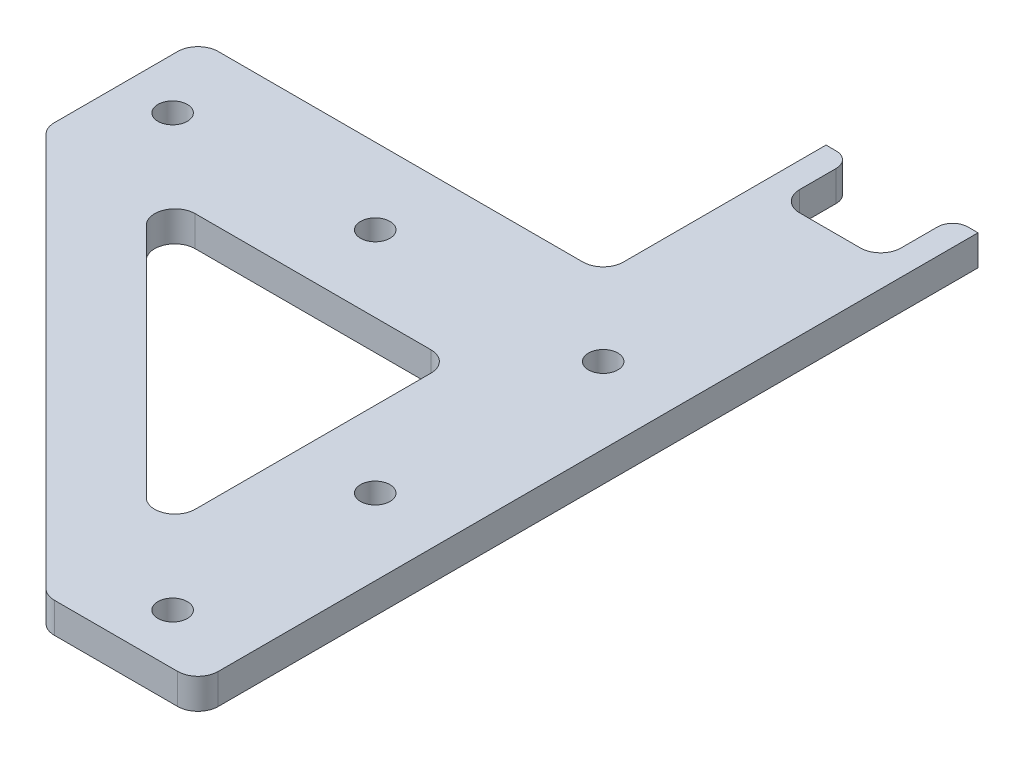
ISO-10303-21;
HEADER;
FILE_DESCRIPTION(('STEP AP214'),'2;1');
FILE_NAME('part.step','',(''),(''),'','','');
FILE_SCHEMA(('AUTOMOTIVE_DESIGN { 1 0 10303 214 1 1 1 1 }'));
ENDSEC;
DATA;
#1=APPLICATION_CONTEXT('core data for automotive mechanical design processes');
#2=APPLICATION_PROTOCOL_DEFINITION('international standard','automotive_design',2000,#1);
#3=PRODUCT_CONTEXT('',#1,'mechanical');
#4=PRODUCT('Part','Part','',(#3));
#5=PRODUCT_RELATED_PRODUCT_CATEGORY('part','',(#4));
#6=PRODUCT_DEFINITION_FORMATION('','',#4);
#7=PRODUCT_DEFINITION_CONTEXT('part definition',#1,'design');
#8=PRODUCT_DEFINITION('design','',#6,#7);
#9=PRODUCT_DEFINITION_SHAPE('','',#8);
#10=(LENGTH_UNIT() NAMED_UNIT(*) SI_UNIT(.MILLI.,.METRE.));
#11=(NAMED_UNIT(*) PLANE_ANGLE_UNIT() SI_UNIT($,.RADIAN.));
#12=(NAMED_UNIT(*) SI_UNIT($,.STERADIAN.) SOLID_ANGLE_UNIT());
#13=UNCERTAINTY_MEASURE_WITH_UNIT(LENGTH_MEASURE(1.E-05),#10,'distance_accuracy_value','');
#14=(GEOMETRIC_REPRESENTATION_CONTEXT(3) GLOBAL_UNCERTAINTY_ASSIGNED_CONTEXT((#13)) GLOBAL_UNIT_ASSIGNED_CONTEXT((#10,
#11,#12)) REPRESENTATION_CONTEXT('',''));
#15=CARTESIAN_POINT('',(0.,0.,0.));
#16=DIRECTION('',(0.,0.,1.));
#17=DIRECTION('',(1.,0.,0.));
#18=AXIS2_PLACEMENT_3D('',#15,#16,#17);
#19=CARTESIAN_POINT('',(-7.5,-26.6270539113887,-22.));
#20=DIRECTION('',(0.,0.,-1.));
#21=DIRECTION('',(-1.,0.,0.));
#22=AXIS2_PLACEMENT_3D('',#19,#20,#21);
#23=PLANE('',#22);
#24=DIRECTION('',(-1.,0.,0.));
#25=VECTOR('',#24,1.);
#26=CARTESIAN_POINT('',(-7.5,3.,-22.));
#27=LINE('',#26,#25);
#28=CARTESIAN_POINT('',(-6.5,3.,-22.));
#29=VERTEX_POINT('',#28);
#30=CARTESIAN_POINT('',(-7.5,3.,-22.));
#31=VERTEX_POINT('',#30);
#32=EDGE_CURVE('E212',#29,#31,#27,.T.);
#33=ORIENTED_EDGE('',*,*,#32,.F.);
#34=DIRECTION('',(0.,1.,0.));
#35=VECTOR('',#34,1.);
#36=CARTESIAN_POINT('',(-6.5,0.,-22.));
#37=LINE('',#36,#35);
#38=CARTESIAN_POINT('',(-6.5,0.,-22.));
#39=VERTEX_POINT('',#38);
#40=EDGE_CURVE('E11',#29,#39,#37,.F.);
#41=ORIENTED_EDGE('',*,*,#40,.T.);
#42=DIRECTION('',(-1.,0.,0.));
#43=VECTOR('',#42,1.);
#44=CARTESIAN_POINT('',(-7.5,0.,-22.));
#45=LINE('',#44,#43);
#46=CARTESIAN_POINT('',(-7.5,0.,-22.));
#47=VERTEX_POINT('',#46);
#48=EDGE_CURVE('E225',#39,#47,#45,.T.);
#49=ORIENTED_EDGE('',*,*,#48,.T.);
#50=DIRECTION('',(0.,1.,0.));
#51=VECTOR('',#50,1.);
#52=CARTESIAN_POINT('',(-7.5,-26.6270539113887,-22.));
#53=LINE('',#52,#51);
#54=EDGE_CURVE('E224',#47,#31,#53,.T.);
#55=ORIENTED_EDGE('',*,*,#54,.T.);
#56=EDGE_LOOP('',(#33,#41,#49,#55));
#57=FACE_BOUND('',#56,.T.);
#58=ADVANCED_FACE('F41',(#57),#23,.T.);
#59=CARTESIAN_POINT('',(-47.5,3.,0.));
#60=DIRECTION('',(0.,0.,1.));
#61=DIRECTION('',(1.,0.,0.));
#62=AXIS2_PLACEMENT_3D('',#59,#60,#61);
#63=PLANE('',#62);
#64=DIRECTION('',(-1.,0.,0.));
#65=VECTOR('',#64,1.);
#66=CARTESIAN_POINT('',(-47.5,0.,0.));
#67=LINE('',#66,#65);
#68=CARTESIAN_POINT('',(-9.5,0.,0.));
#69=VERTEX_POINT('',#68);
#70=CARTESIAN_POINT('',(-45.5,0.,0.));
#71=VERTEX_POINT('',#70);
#72=EDGE_CURVE('E296',#69,#71,#67,.T.);
#73=ORIENTED_EDGE('',*,*,#72,.T.);
#74=DIRECTION('',(0.,-1.,0.));
#75=VECTOR('',#74,1.);
#76=CARTESIAN_POINT('',(-45.5,3.,0.));
#77=LINE('',#76,#75);
#78=CARTESIAN_POINT('',(-45.5,3.,0.));
#79=VERTEX_POINT('',#78);
#80=EDGE_CURVE('E387',#71,#79,#77,.F.);
#81=ORIENTED_EDGE('',*,*,#80,.T.);
#82=DIRECTION('',(-1.,0.,0.));
#83=VECTOR('',#82,1.);
#84=CARTESIAN_POINT('',(0.,3.,0.));
#85=LINE('',#84,#83);
#86=CARTESIAN_POINT('',(-9.5,3.,0.));
#87=VERTEX_POINT('',#86);
#88=EDGE_CURVE('E307',#87,#79,#85,.T.);
#89=ORIENTED_EDGE('',*,*,#88,.F.);
#90=DIRECTION('',(0.,1.,0.));
#91=VECTOR('',#90,1.);
#92=CARTESIAN_POINT('',(-9.5,3.,0.));
#93=LINE('',#92,#91);
#94=EDGE_CURVE('E385',#87,#69,#93,.F.);
#95=ORIENTED_EDGE('',*,*,#94,.T.);
#96=EDGE_LOOP('',(#73,#81,#89,#95));
#97=FACE_BOUND('',#96,.T.);
#98=ADVANCED_FACE('F507',(#97),#63,.F.);
#99=CARTESIAN_POINT('',(0.,3.,0.));
#100=DIRECTION('',(0.,-1.,0.));
#101=DIRECTION('',(0.,0.,-1.));
#102=AXIS2_PLACEMENT_3D('',#99,#100,#101);
#103=PLANE('',#102);
#104=DIRECTION('',(0.,0.,1.));
#105=VECTOR('',#104,1.);
#106=CARTESIAN_POINT('',(-7.5,3.,55.));
#107=LINE('',#106,#105);
#108=CARTESIAN_POINT('',(-7.5,3.,17.));
#109=VERTEX_POINT('',#108);
#110=CARTESIAN_POINT('',(-7.5,3.,40.2720779386421));
#111=VERTEX_POINT('',#110);
#112=EDGE_CURVE('E299',#109,#111,#107,.T.);
#113=ORIENTED_EDGE('',*,*,#112,.T.);
#114=CARTESIAN_POINT('',(-9.5,3.,40.2720779386421));
#115=DIRECTION('',(0.,-1.,0.));
#116=DIRECTION('',(0.,0.,-1.));
#117=AXIS2_PLACEMENT_3D('',#114,#115,#116);
#118=CIRCLE('',#117,2.);
#119=CARTESIAN_POINT('',(-10.9142135623731,3.,41.6862915010152));
#120=VERTEX_POINT('',#119);
#121=EDGE_CURVE('E390',#111,#120,#118,.T.);
#122=ORIENTED_EDGE('',*,*,#121,.T.);
#123=DIRECTION('',(-0.707106781186547,0.,-0.707106781186547));
#124=VECTOR('',#123,1.);
#125=CARTESIAN_POINT('',(-7.5,3.,45.1005050633883));
#126=LINE('',#125,#124);
#127=CARTESIAN_POINT('',(-34.1862915010152,3.,18.4142135623731));
#128=VERTEX_POINT('',#127);
#129=EDGE_CURVE('E250',#120,#128,#126,.T.);
#130=ORIENTED_EDGE('',*,*,#129,.T.);
#131=CARTESIAN_POINT('',(-32.7720779386421,3.,17.));
#132=DIRECTION('',(0.,-1.,0.));
#133=DIRECTION('',(0.,0.,-1.));
#134=AXIS2_PLACEMENT_3D('',#131,#132,#133);
#135=CIRCLE('',#134,2.);
#136=CARTESIAN_POINT('',(-32.7720779386421,3.,15.));
#137=VERTEX_POINT('',#136);
#138=EDGE_CURVE('E394',#128,#137,#135,.T.);
#139=ORIENTED_EDGE('',*,*,#138,.T.);
#140=DIRECTION('',(1.,0.,0.));
#141=VECTOR('',#140,1.);
#142=CARTESIAN_POINT('',(-7.5,3.,15.));
#143=LINE('',#142,#141);
#144=CARTESIAN_POINT('',(-9.5,3.,15.));
#145=VERTEX_POINT('',#144);
#146=EDGE_CURVE('E295',#137,#145,#143,.T.);
#147=ORIENTED_EDGE('',*,*,#146,.T.);
#148=CARTESIAN_POINT('',(-9.5,3.,17.));
#149=DIRECTION('',(0.,-1.,0.));
#150=DIRECTION('',(0.,0.,-1.));
#151=AXIS2_PLACEMENT_3D('',#148,#149,#150);
#152=CIRCLE('',#151,2.);
#153=EDGE_CURVE('E400',#145,#109,#152,.T.);
#154=ORIENTED_EDGE('',*,*,#153,.T.);
#155=EDGE_LOOP('',(#113,#122,#130,#139,#147,#154));
#156=FACE_BOUND('',#155,.T.);
#157=CARTESIAN_POINT('',(7.5,3.,-22.));
#158=VERTEX_POINT('',#157);
#159=CARTESIAN_POINT('',(6.5,3.,-22.));
#160=VERTEX_POINT('',#159);
#161=EDGE_CURVE('E221',#158,#160,#27,.T.);
#162=ORIENTED_EDGE('',*,*,#161,.T.);
#163=CARTESIAN_POINT('',(6.5,3.,-20.5));
#164=DIRECTION('',(0.,-1.,0.));
#165=DIRECTION('',(0.,0.,-1.));
#166=AXIS2_PLACEMENT_3D('',#163,#164,#165);
#167=CIRCLE('',#166,1.5);
#168=CARTESIAN_POINT('',(5.,3.,-20.5));
#169=VERTEX_POINT('',#168);
#170=EDGE_CURVE('E419',#160,#169,#167,.F.);
#171=ORIENTED_EDGE('',*,*,#170,.T.);
#172=DIRECTION('',(0.,0.,-1.));
#173=VECTOR('',#172,1.);
#174=CARTESIAN_POINT('',(5.,3.,-22.));
#175=LINE('',#174,#173);
#176=CARTESIAN_POINT('',(5.,3.,-16.9));
#177=VERTEX_POINT('',#176);
#178=EDGE_CURVE('E437',#177,#169,#175,.T.);
#179=ORIENTED_EDGE('',*,*,#178,.F.);
#180=CARTESIAN_POINT('',(3.,3.,-16.9));
#181=DIRECTION('',(0.,-1.,0.));
#182=DIRECTION('',(0.,0.,-1.));
#183=AXIS2_PLACEMENT_3D('',#180,#181,#182);
#184=CIRCLE('',#183,2.);
#185=CARTESIAN_POINT('',(3.,3.,-14.9));
#186=VERTEX_POINT('',#185);
#187=EDGE_CURVE('E402',#177,#186,#184,.T.);
#188=ORIENTED_EDGE('',*,*,#187,.T.);
#189=DIRECTION('',(1.,0.,0.));
#190=VECTOR('',#189,1.);
#191=CARTESIAN_POINT('',(-5.,3.,-14.9));
#192=LINE('',#191,#190);
#193=CARTESIAN_POINT('',(-3.,3.,-14.9));
#194=VERTEX_POINT('',#193);
#195=EDGE_CURVE('E434',#194,#186,#192,.T.);
#196=ORIENTED_EDGE('',*,*,#195,.F.);
#197=CARTESIAN_POINT('',(-3.,3.,-16.9));
#198=DIRECTION('',(0.,-1.,0.));
#199=DIRECTION('',(0.,0.,-1.));
#200=AXIS2_PLACEMENT_3D('',#197,#198,#199);
#201=CIRCLE('',#200,2.);
#202=CARTESIAN_POINT('',(-5.,3.,-16.9));
#203=VERTEX_POINT('',#202);
#204=EDGE_CURVE('E406',#194,#203,#201,.T.);
#205=ORIENTED_EDGE('',*,*,#204,.T.);
#206=DIRECTION('',(0.,0.,1.));
#207=VECTOR('',#206,1.);
#208=CARTESIAN_POINT('',(-5.,3.,-22.));
#209=LINE('',#208,#207);
#210=CARTESIAN_POINT('',(-5.,3.,-20.5));
#211=VERTEX_POINT('',#210);
#212=EDGE_CURVE('E429',#211,#203,#209,.T.);
#213=ORIENTED_EDGE('',*,*,#212,.F.);
#214=CARTESIAN_POINT('',(-6.5,3.,-20.5));
#215=DIRECTION('',(0.,-1.,0.));
#216=DIRECTION('',(0.,0.,-1.));
#217=AXIS2_PLACEMENT_3D('',#214,#215,#216);
#218=CIRCLE('',#217,1.5);
#219=EDGE_CURVE('E220',#211,#29,#218,.F.);
#220=ORIENTED_EDGE('',*,*,#219,.T.);
#221=ORIENTED_EDGE('',*,*,#32,.T.);
#222=DIRECTION('',(0.,0.,1.));
#223=VECTOR('',#222,1.);
#224=CARTESIAN_POINT('',(-7.5,3.,0.));
#225=LINE('',#224,#223);
#226=CARTESIAN_POINT('',(-7.5,3.,-2.));
#227=VERTEX_POINT('',#226);
#228=EDGE_CURVE('E218',#31,#227,#225,.T.);
#229=ORIENTED_EDGE('',*,*,#228,.T.);
#230=CARTESIAN_POINT('',(-9.5,3.,-2.));
#231=DIRECTION('',(0.,-1.,0.));
#232=DIRECTION('',(0.,0.,-1.));
#233=AXIS2_PLACEMENT_3D('',#230,#231,#232);
#234=CIRCLE('',#233,2.);
#235=EDGE_CURVE('E411',#227,#87,#234,.T.);
#236=ORIENTED_EDGE('',*,*,#235,.T.);
#237=ORIENTED_EDGE('',*,*,#88,.T.);
#238=CARTESIAN_POINT('',(-45.5,3.,2.));
#239=DIRECTION('',(0.,-1.,0.));
#240=DIRECTION('',(0.,0.,-1.));
#241=AXIS2_PLACEMENT_3D('',#238,#239,#240);
#242=CIRCLE('',#241,2.);
#243=CARTESIAN_POINT('',(-47.5,3.,2.));
#244=VERTEX_POINT('',#243);
#245=EDGE_CURVE('E364',#79,#244,#242,.F.);
#246=ORIENTED_EDGE('',*,*,#245,.T.);
#247=DIRECTION('',(0.,0.,1.));
#248=VECTOR('',#247,1.);
#249=CARTESIAN_POINT('',(-47.5,3.,15.));
#250=LINE('',#249,#248);
#251=CARTESIAN_POINT('',(-47.5,3.,14.1715728752538));
#252=VERTEX_POINT('',#251);
#253=EDGE_CURVE('E292',#244,#252,#250,.T.);
#254=ORIENTED_EDGE('',*,*,#253,.T.);
#255=CARTESIAN_POINT('',(-45.5,3.,14.1715728752538));
#256=DIRECTION('',(0.,-1.,0.));
#257=DIRECTION('',(0.,0.,-1.));
#258=AXIS2_PLACEMENT_3D('',#255,#256,#257);
#259=CIRCLE('',#258,2.);
#260=CARTESIAN_POINT('',(-46.9142135623731,3.,15.5857864376269));
#261=VERTEX_POINT('',#260);
#262=EDGE_CURVE('E366',#252,#261,#259,.F.);
#263=ORIENTED_EDGE('',*,*,#262,.T.);
#264=DIRECTION('',(0.707106781186547,0.,0.707106781186548));
#265=VECTOR('',#264,1.);
#266=CARTESIAN_POINT('',(-47.5,3.,15.));
#267=LINE('',#266,#265);
#268=CARTESIAN_POINT('',(-8.0857864376269,3.,54.4142135623731));
#269=VERTEX_POINT('',#268);
#270=EDGE_CURVE('E244',#261,#269,#267,.T.);
#271=ORIENTED_EDGE('',*,*,#270,.T.);
#272=CARTESIAN_POINT('',(-6.67157287525381,3.,53.));
#273=DIRECTION('',(0.,-1.,0.));
#274=DIRECTION('',(0.,0.,-1.));
#275=AXIS2_PLACEMENT_3D('',#272,#273,#274);
#276=CIRCLE('',#275,2.);
#277=CARTESIAN_POINT('',(-6.67157287525381,3.,55.));
#278=VERTEX_POINT('',#277);
#279=EDGE_CURVE('E368',#269,#278,#276,.F.);
#280=ORIENTED_EDGE('',*,*,#279,.T.);
#281=DIRECTION('',(1.,0.,0.));
#282=VECTOR('',#281,1.);
#283=CARTESIAN_POINT('',(7.5,3.,55.));
#284=LINE('',#283,#282);
#285=CARTESIAN_POINT('',(5.5,3.,55.));
#286=VERTEX_POINT('',#285);
#287=EDGE_CURVE('E302',#278,#286,#284,.T.);
#288=ORIENTED_EDGE('',*,*,#287,.T.);
#289=CARTESIAN_POINT('',(5.5,3.,53.));
#290=DIRECTION('',(0.,-1.,0.));
#291=DIRECTION('',(0.,0.,-1.));
#292=AXIS2_PLACEMENT_3D('',#289,#290,#291);
#293=CIRCLE('',#292,2.);
#294=CARTESIAN_POINT('',(7.5,3.,53.));
#295=VERTEX_POINT('',#294);
#296=EDGE_CURVE('E370',#286,#295,#293,.F.);
#297=ORIENTED_EDGE('',*,*,#296,.T.);
#298=DIRECTION('',(0.,0.,-1.));
#299=VECTOR('',#298,1.);
#300=CARTESIAN_POINT('',(7.5,3.,15.));
#301=LINE('',#300,#299);
#302=EDGE_CURVE('E305',#295,#158,#301,.T.);
#303=ORIENTED_EDGE('',*,*,#302,.T.);
#304=EDGE_LOOP('',(#162,#171,#179,#188,#196,#205,#213,#220,#221,#229,#236,#237,#246,#254,#263,
#271,#280,#288,#297,#303));
#305=FACE_BOUND('',#304,.T.);
#306=CARTESIAN_POINT('',(0.,3.,7.5));
#307=DIRECTION('',(0.,1.,0.));
#308=DIRECTION('',(0.,0.,1.));
#309=AXIS2_PLACEMENT_3D('',#306,#307,#308);
#310=CIRCLE('',#309,1.45);
#311=CARTESIAN_POINT('',(0.,3.,8.95));
#312=VERTEX_POINT('',#311);
#313=EDGE_CURVE('E286',#312,#312,#310,.T.);
#314=ORIENTED_EDGE('',*,*,#313,.F.);
#315=EDGE_LOOP('',(#314));
#316=FACE_BOUND('',#315,.T.);
#317=CARTESIAN_POINT('',(0.,3.,30.));
#318=DIRECTION('',(0.,1.,0.));
#319=DIRECTION('',(0.,0.,1.));
#320=AXIS2_PLACEMENT_3D('',#317,#318,#319);
#321=CIRCLE('',#320,1.45);
#322=CARTESIAN_POINT('',(0.,3.,31.45));
#323=VERTEX_POINT('',#322);
#324=EDGE_CURVE('E280',#323,#323,#321,.T.);
#325=ORIENTED_EDGE('',*,*,#324,.F.);
#326=EDGE_LOOP('',(#325));
#327=FACE_BOUND('',#326,.T.);
#328=CARTESIAN_POINT('',(0.,3.,50.));
#329=DIRECTION('',(0.,1.,0.));
#330=DIRECTION('',(0.,0.,1.));
#331=AXIS2_PLACEMENT_3D('',#328,#329,#330);
#332=CIRCLE('',#331,1.45);
#333=CARTESIAN_POINT('',(0.,3.,51.45));
#334=VERTEX_POINT('',#333);
#335=EDGE_CURVE('E274',#334,#334,#332,.T.);
#336=ORIENTED_EDGE('',*,*,#335,.F.);
#337=EDGE_LOOP('',(#336));
#338=FACE_BOUND('',#337,.T.);
#339=CARTESIAN_POINT('',(-22.5,3.,7.5));
#340=DIRECTION('',(0.,1.,0.));
#341=DIRECTION('',(0.,0.,1.));
#342=AXIS2_PLACEMENT_3D('',#339,#340,#341);
#343=CIRCLE('',#342,1.45);
#344=CARTESIAN_POINT('',(-22.5,3.,8.95));
#345=VERTEX_POINT('',#344);
#346=EDGE_CURVE('E268',#345,#345,#343,.T.);
#347=ORIENTED_EDGE('',*,*,#346,.F.);
#348=EDGE_LOOP('',(#347));
#349=FACE_BOUND('',#348,.T.);
#350=CARTESIAN_POINT('',(-42.5,3.,7.5));
#351=DIRECTION('',(0.,1.,0.));
#352=DIRECTION('',(0.,0.,1.));
#353=AXIS2_PLACEMENT_3D('',#350,#351,#352);
#354=CIRCLE('',#353,1.45);
#355=CARTESIAN_POINT('',(-42.5,3.,8.95));
#356=VERTEX_POINT('',#355);
#357=EDGE_CURVE('E262',#356,#356,#354,.T.);
#358=ORIENTED_EDGE('',*,*,#357,.F.);
#359=EDGE_LOOP('',(#358));
#360=FACE_BOUND('',#359,.T.);
#361=ADVANCED_FACE('F215',(#156,#305,#316,#327,#338,#349,#360),#103,.F.);
#362=CARTESIAN_POINT('',(0.,0.,0.));
#363=DIRECTION('',(0.,-1.,0.));
#364=DIRECTION('',(0.,0.,-1.));
#365=AXIS2_PLACEMENT_3D('',#362,#363,#364);
#366=PLANE('',#365);
#367=DIRECTION('',(0.,0.,-1.));
#368=VECTOR('',#367,1.);
#369=CARTESIAN_POINT('',(5.,0.,-22.));
#370=LINE('',#369,#368);
#371=CARTESIAN_POINT('',(5.,0.,-16.9));
#372=VERTEX_POINT('',#371);
#373=CARTESIAN_POINT('',(5.,0.,-20.5));
#374=VERTEX_POINT('',#373);
#375=EDGE_CURVE('E236',#372,#374,#370,.T.);
#376=ORIENTED_EDGE('',*,*,#375,.T.);
#377=CARTESIAN_POINT('',(6.5,0.,-20.5));
#378=DIRECTION('',(0.,-1.,0.));
#379=DIRECTION('',(0.,0.,-1.));
#380=AXIS2_PLACEMENT_3D('',#377,#378,#379);
#381=CIRCLE('',#380,1.5);
#382=CARTESIAN_POINT('',(6.5,0.,-22.));
#383=VERTEX_POINT('',#382);
#384=EDGE_CURVE('E424',#374,#383,#381,.T.);
#385=ORIENTED_EDGE('',*,*,#384,.T.);
#386=CARTESIAN_POINT('',(7.5,0.,-22.));
#387=VERTEX_POINT('',#386);
#388=EDGE_CURVE('E230',#387,#383,#45,.T.);
#389=ORIENTED_EDGE('',*,*,#388,.F.);
#390=DIRECTION('',(0.,0.,-1.));
#391=VECTOR('',#390,1.);
#392=CARTESIAN_POINT('',(7.5,0.,15.));
#393=LINE('',#392,#391);
#394=CARTESIAN_POINT('',(7.5,0.,53.));
#395=VERTEX_POINT('',#394);
#396=EDGE_CURVE('E322',#395,#387,#393,.T.);
#397=ORIENTED_EDGE('',*,*,#396,.F.);
#398=CARTESIAN_POINT('',(5.5,0.,53.));
#399=DIRECTION('',(0.,-1.,0.));
#400=DIRECTION('',(0.,0.,-1.));
#401=AXIS2_PLACEMENT_3D('',#398,#399,#400);
#402=CIRCLE('',#401,2.);
#403=CARTESIAN_POINT('',(5.5,0.,55.));
#404=VERTEX_POINT('',#403);
#405=EDGE_CURVE('E357',#395,#404,#402,.T.);
#406=ORIENTED_EDGE('',*,*,#405,.T.);
#407=DIRECTION('',(1.,0.,0.));
#408=VECTOR('',#407,1.);
#409=CARTESIAN_POINT('',(7.5,0.,55.));
#410=LINE('',#409,#408);
#411=CARTESIAN_POINT('',(-6.67157287525381,0.,55.));
#412=VERTEX_POINT('',#411);
#413=EDGE_CURVE('E319',#412,#404,#410,.T.);
#414=ORIENTED_EDGE('',*,*,#413,.F.);
#415=CARTESIAN_POINT('',(-6.67157287525381,0.,53.));
#416=DIRECTION('',(0.,-1.,0.));
#417=DIRECTION('',(0.,0.,-1.));
#418=AXIS2_PLACEMENT_3D('',#415,#416,#417);
#419=CIRCLE('',#418,2.);
#420=CARTESIAN_POINT('',(-8.0857864376269,0.,54.4142135623731));
#421=VERTEX_POINT('',#420);
#422=EDGE_CURVE('E355',#412,#421,#419,.T.);
#423=ORIENTED_EDGE('',*,*,#422,.T.);
#424=DIRECTION('',(0.707106781186547,0.,0.707106781186548));
#425=VECTOR('',#424,1.);
#426=CARTESIAN_POINT('',(-47.5,0.,15.));
#427=LINE('',#426,#425);
#428=CARTESIAN_POINT('',(-46.9142135623731,0.,15.5857864376269));
#429=VERTEX_POINT('',#428);
#430=EDGE_CURVE('E253',#429,#421,#427,.T.);
#431=ORIENTED_EDGE('',*,*,#430,.F.);
#432=CARTESIAN_POINT('',(-45.5,0.,14.1715728752538));
#433=DIRECTION('',(0.,-1.,0.));
#434=DIRECTION('',(0.,0.,-1.));
#435=AXIS2_PLACEMENT_3D('',#432,#433,#434);
#436=CIRCLE('',#435,2.);
#437=CARTESIAN_POINT('',(-47.5,0.,14.1715728752538));
#438=VERTEX_POINT('',#437);
#439=EDGE_CURVE('E353',#429,#438,#436,.T.);
#440=ORIENTED_EDGE('',*,*,#439,.T.);
#441=DIRECTION('',(0.,0.,1.));
#442=VECTOR('',#441,1.);
#443=CARTESIAN_POINT('',(-47.5,0.,15.));
#444=LINE('',#443,#442);
#445=CARTESIAN_POINT('',(-47.5,0.,2.));
#446=VERTEX_POINT('',#445);
#447=EDGE_CURVE('E289',#446,#438,#444,.T.);
#448=ORIENTED_EDGE('',*,*,#447,.F.);
#449=CARTESIAN_POINT('',(-45.5,0.,2.));
#450=DIRECTION('',(0.,-1.,0.));
#451=DIRECTION('',(0.,0.,-1.));
#452=AXIS2_PLACEMENT_3D('',#449,#450,#451);
#453=CIRCLE('',#452,2.);
#454=EDGE_CURVE('E351',#446,#71,#453,.T.);
#455=ORIENTED_EDGE('',*,*,#454,.T.);
#456=ORIENTED_EDGE('',*,*,#72,.F.);
#457=CARTESIAN_POINT('',(-9.5,0.,-2.));
#458=DIRECTION('',(0.,-1.,0.));
#459=DIRECTION('',(0.,0.,-1.));
#460=AXIS2_PLACEMENT_3D('',#457,#458,#459);
#461=CIRCLE('',#460,2.);
#462=CARTESIAN_POINT('',(-7.5,0.,-2.));
#463=VERTEX_POINT('',#462);
#464=EDGE_CURVE('E413',#69,#463,#461,.F.);
#465=ORIENTED_EDGE('',*,*,#464,.T.);
#466=DIRECTION('',(0.,0.,1.));
#467=VECTOR('',#466,1.);
#468=CARTESIAN_POINT('',(-7.5,0.,0.));
#469=LINE('',#468,#467);
#470=EDGE_CURVE('E229',#47,#463,#469,.T.);
#471=ORIENTED_EDGE('',*,*,#470,.F.);
#472=ORIENTED_EDGE('',*,*,#48,.F.);
#473=CARTESIAN_POINT('',(-6.5,0.,-20.5));
#474=DIRECTION('',(0.,-1.,0.));
#475=DIRECTION('',(0.,0.,-1.));
#476=AXIS2_PLACEMENT_3D('',#473,#474,#475);
#477=CIRCLE('',#476,1.5);
#478=CARTESIAN_POINT('',(-5.,0.,-20.5));
#479=VERTEX_POINT('',#478);
#480=EDGE_CURVE('E56',#39,#479,#477,.T.);
#481=ORIENTED_EDGE('',*,*,#480,.T.);
#482=DIRECTION('',(0.,0.,1.));
#483=VECTOR('',#482,1.);
#484=CARTESIAN_POINT('',(-5.,0.,-22.));
#485=LINE('',#484,#483);
#486=CARTESIAN_POINT('',(-5.,0.,-16.9));
#487=VERTEX_POINT('',#486);
#488=EDGE_CURVE('E430',#479,#487,#485,.T.);
#489=ORIENTED_EDGE('',*,*,#488,.T.);
#490=CARTESIAN_POINT('',(-3.,0.,-16.9));
#491=DIRECTION('',(0.,-1.,0.));
#492=DIRECTION('',(0.,0.,-1.));
#493=AXIS2_PLACEMENT_3D('',#490,#491,#492);
#494=CIRCLE('',#493,2.);
#495=CARTESIAN_POINT('',(-3.,0.,-14.9));
#496=VERTEX_POINT('',#495);
#497=EDGE_CURVE('E409',#487,#496,#494,.F.);
#498=ORIENTED_EDGE('',*,*,#497,.T.);
#499=DIRECTION('',(1.,0.,0.));
#500=VECTOR('',#499,1.);
#501=CARTESIAN_POINT('',(-5.,0.,-14.9));
#502=LINE('',#501,#500);
#503=CARTESIAN_POINT('',(3.,0.,-14.9));
#504=VERTEX_POINT('',#503);
#505=EDGE_CURVE('E239',#496,#504,#502,.T.);
#506=ORIENTED_EDGE('',*,*,#505,.T.);
#507=CARTESIAN_POINT('',(3.,0.,-16.9));
#508=DIRECTION('',(0.,-1.,0.));
#509=DIRECTION('',(0.,0.,-1.));
#510=AXIS2_PLACEMENT_3D('',#507,#508,#509);
#511=CIRCLE('',#510,2.);
#512=EDGE_CURVE('E404',#504,#372,#511,.F.);
#513=ORIENTED_EDGE('',*,*,#512,.T.);
#514=EDGE_LOOP('',(#376,#385,#389,#397,#406,#414,#423,#431,#440,#448,#455,#456,#465,#471,#472,
#481,#489,#498,#506,#513));
#515=FACE_BOUND('',#514,.T.);
#516=DIRECTION('',(1.,0.,0.));
#517=VECTOR('',#516,1.);
#518=CARTESIAN_POINT('',(-7.5,0.,15.));
#519=LINE('',#518,#517);
#520=CARTESIAN_POINT('',(-32.7720779386421,0.,15.));
#521=VERTEX_POINT('',#520);
#522=CARTESIAN_POINT('',(-9.5,0.,15.));
#523=VERTEX_POINT('',#522);
#524=EDGE_CURVE('E313',#521,#523,#519,.T.);
#525=ORIENTED_EDGE('',*,*,#524,.F.);
#526=CARTESIAN_POINT('',(-32.7720779386421,0.,17.));
#527=DIRECTION('',(0.,-1.,0.));
#528=DIRECTION('',(0.,0.,-1.));
#529=AXIS2_PLACEMENT_3D('',#526,#527,#528);
#530=CIRCLE('',#529,2.);
#531=CARTESIAN_POINT('',(-34.1862915010152,0.,18.4142135623731));
#532=VERTEX_POINT('',#531);
#533=EDGE_CURVE('E396',#521,#532,#530,.F.);
#534=ORIENTED_EDGE('',*,*,#533,.T.);
#535=DIRECTION('',(-0.707106781186548,0.,-0.707106781186548));
#536=VECTOR('',#535,1.);
#537=CARTESIAN_POINT('',(-7.5,0.,45.1005050633883));
#538=LINE('',#537,#536);
#539=CARTESIAN_POINT('',(-10.9142135623731,0.,41.6862915010152));
#540=VERTEX_POINT('',#539);
#541=EDGE_CURVE('E258',#540,#532,#538,.T.);
#542=ORIENTED_EDGE('',*,*,#541,.F.);
#543=CARTESIAN_POINT('',(-9.5,0.,40.2720779386421));
#544=DIRECTION('',(0.,-1.,0.));
#545=DIRECTION('',(0.,0.,-1.));
#546=AXIS2_PLACEMENT_3D('',#543,#544,#545);
#547=CIRCLE('',#546,2.);
#548=CARTESIAN_POINT('',(-7.5,0.,40.2720779386421));
#549=VERTEX_POINT('',#548);
#550=EDGE_CURVE('E392',#540,#549,#547,.F.);
#551=ORIENTED_EDGE('',*,*,#550,.T.);
#552=DIRECTION('',(0.,0.,1.));
#553=VECTOR('',#552,1.);
#554=CARTESIAN_POINT('',(-7.5,0.,55.));
#555=LINE('',#554,#553);
#556=CARTESIAN_POINT('',(-7.5,0.,17.));
#557=VERTEX_POINT('',#556);
#558=EDGE_CURVE('E316',#557,#549,#555,.T.);
#559=ORIENTED_EDGE('',*,*,#558,.F.);
#560=CARTESIAN_POINT('',(-9.5,0.,17.));
#561=DIRECTION('',(0.,-1.,0.));
#562=DIRECTION('',(0.,0.,-1.));
#563=AXIS2_PLACEMENT_3D('',#560,#561,#562);
#564=CIRCLE('',#563,2.);
#565=EDGE_CURVE('E398',#557,#523,#564,.F.);
#566=ORIENTED_EDGE('',*,*,#565,.T.);
#567=EDGE_LOOP('',(#525,#534,#542,#551,#559,#566));
#568=FACE_BOUND('',#567,.T.);
#569=CARTESIAN_POINT('',(-22.5,0.,7.5));
#570=DIRECTION('',(0.,1.,0.));
#571=DIRECTION('',(0.,0.,1.));
#572=AXIS2_PLACEMENT_3D('',#569,#570,#571);
#573=CIRCLE('',#572,1.45);
#574=CARTESIAN_POINT('',(-22.5,0.,8.95));
#575=VERTEX_POINT('',#574);
#576=EDGE_CURVE('E265',#575,#575,#573,.T.);
#577=ORIENTED_EDGE('',*,*,#576,.T.);
#578=EDGE_LOOP('',(#577));
#579=FACE_BOUND('',#578,.T.);
#580=CARTESIAN_POINT('',(0.,0.,30.));
#581=DIRECTION('',(0.,1.,0.));
#582=DIRECTION('',(0.,0.,1.));
#583=AXIS2_PLACEMENT_3D('',#580,#581,#582);
#584=CIRCLE('',#583,1.45);
#585=CARTESIAN_POINT('',(0.,0.,31.45));
#586=VERTEX_POINT('',#585);
#587=EDGE_CURVE('E277',#586,#586,#584,.T.);
#588=ORIENTED_EDGE('',*,*,#587,.T.);
#589=EDGE_LOOP('',(#588));
#590=FACE_BOUND('',#589,.T.);
#591=CARTESIAN_POINT('',(0.,0.,7.5));
#592=DIRECTION('',(0.,1.,0.));
#593=DIRECTION('',(0.,0.,1.));
#594=AXIS2_PLACEMENT_3D('',#591,#592,#593);
#595=CIRCLE('',#594,1.45);
#596=CARTESIAN_POINT('',(0.,0.,8.95));
#597=VERTEX_POINT('',#596);
#598=EDGE_CURVE('E283',#597,#597,#595,.T.);
#599=ORIENTED_EDGE('',*,*,#598,.T.);
#600=EDGE_LOOP('',(#599));
#601=FACE_BOUND('',#600,.T.);
#602=CARTESIAN_POINT('',(0.,0.,50.));
#603=DIRECTION('',(0.,1.,0.));
#604=DIRECTION('',(0.,0.,1.));
#605=AXIS2_PLACEMENT_3D('',#602,#603,#604);
#606=CIRCLE('',#605,1.45);
#607=CARTESIAN_POINT('',(0.,0.,51.45));
#608=VERTEX_POINT('',#607);
#609=EDGE_CURVE('E271',#608,#608,#606,.T.);
#610=ORIENTED_EDGE('',*,*,#609,.T.);
#611=EDGE_LOOP('',(#610));
#612=FACE_BOUND('',#611,.T.);
#613=CARTESIAN_POINT('',(-42.5,0.,7.5));
#614=DIRECTION('',(0.,1.,0.));
#615=DIRECTION('',(0.,0.,1.));
#616=AXIS2_PLACEMENT_3D('',#613,#614,#615);
#617=CIRCLE('',#616,1.45);
#618=CARTESIAN_POINT('',(-42.5,0.,8.95));
#619=VERTEX_POINT('',#618);
#620=EDGE_CURVE('E261',#619,#619,#617,.T.);
#621=ORIENTED_EDGE('',*,*,#620,.T.);
#622=EDGE_LOOP('',(#621));
#623=FACE_BOUND('',#622,.T.);
#624=ADVANCED_FACE('F448',(#515,#568,#579,#590,#601,#612,#623),#366,.T.);
#625=CARTESIAN_POINT('',(-47.5,3.,15.));
#626=DIRECTION('',(1.,0.,0.));
#627=DIRECTION('',(0.,0.,-1.));
#628=AXIS2_PLACEMENT_3D('',#625,#626,#627);
#629=PLANE('',#628);
#630=ORIENTED_EDGE('',*,*,#447,.T.);
#631=DIRECTION('',(0.,-1.,0.));
#632=VECTOR('',#631,1.);
#633=CARTESIAN_POINT('',(-47.5,3.,14.1715728752538));
#634=LINE('',#633,#632);
#635=EDGE_CURVE('E383',#438,#252,#634,.F.);
#636=ORIENTED_EDGE('',*,*,#635,.T.);
#637=ORIENTED_EDGE('',*,*,#253,.F.);
#638=DIRECTION('',(0.,-1.,0.));
#639=VECTOR('',#638,1.);
#640=CARTESIAN_POINT('',(-47.5,3.,2.));
#641=LINE('',#640,#639);
#642=EDGE_CURVE('E380',#244,#446,#641,.T.);
#643=ORIENTED_EDGE('',*,*,#642,.T.);
#644=EDGE_LOOP('',(#630,#636,#637,#643));
#645=FACE_BOUND('',#644,.T.);
#646=ADVANCED_FACE('F497',(#645),#629,.F.);
#647=CARTESIAN_POINT('',(-7.5,3.,15.));
#648=DIRECTION('',(0.,0.,-1.));
#649=DIRECTION('',(-1.,0.,0.));
#650=AXIS2_PLACEMENT_3D('',#647,#648,#649);
#651=PLANE('',#650);
#652=ORIENTED_EDGE('',*,*,#146,.F.);
#653=DIRECTION('',(0.,1.,0.));
#654=VECTOR('',#653,1.);
#655=CARTESIAN_POINT('',(-32.7720779386421,3.,15.));
#656=LINE('',#655,#654);
#657=EDGE_CURVE('E338',#137,#521,#656,.F.);
#658=ORIENTED_EDGE('',*,*,#657,.T.);
#659=ORIENTED_EDGE('',*,*,#524,.T.);
#660=DIRECTION('',(0.,-1.,0.));
#661=VECTOR('',#660,1.);
#662=CARTESIAN_POINT('',(-9.5,3.,15.));
#663=LINE('',#662,#661);
#664=EDGE_CURVE('E336',#523,#145,#663,.F.);
#665=ORIENTED_EDGE('',*,*,#664,.T.);
#666=EDGE_LOOP('',(#652,#658,#659,#665));
#667=FACE_BOUND('',#666,.T.);
#668=ADVANCED_FACE('F571',(#667),#651,.F.);
#669=CARTESIAN_POINT('',(-7.5,3.,55.));
#670=DIRECTION('',(1.,0.,0.));
#671=DIRECTION('',(0.,0.,-1.));
#672=AXIS2_PLACEMENT_3D('',#669,#670,#671);
#673=PLANE('',#672);
#674=ORIENTED_EDGE('',*,*,#558,.T.);
#675=DIRECTION('',(0.,1.,0.));
#676=VECTOR('',#675,1.);
#677=CARTESIAN_POINT('',(-7.5,3.,40.2720779386421));
#678=LINE('',#677,#676);
#679=EDGE_CURVE('E328',#549,#111,#678,.T.);
#680=ORIENTED_EDGE('',*,*,#679,.T.);
#681=ORIENTED_EDGE('',*,*,#112,.F.);
#682=DIRECTION('',(0.,-1.,0.));
#683=VECTOR('',#682,1.);
#684=CARTESIAN_POINT('',(-7.5,0.,17.));
#685=LINE('',#684,#683);
#686=EDGE_CURVE('E310',#109,#557,#685,.T.);
#687=ORIENTED_EDGE('',*,*,#686,.T.);
#688=EDGE_LOOP('',(#674,#680,#681,#687));
#689=FACE_BOUND('',#688,.T.);
#690=ADVANCED_FACE('F568',(#689),#673,.F.);
#691=CARTESIAN_POINT('',(7.5,3.,55.));
#692=DIRECTION('',(0.,0.,-1.));
#693=DIRECTION('',(-1.,0.,0.));
#694=AXIS2_PLACEMENT_3D('',#691,#692,#693);
#695=PLANE('',#694);
#696=ORIENTED_EDGE('',*,*,#413,.T.);
#697=DIRECTION('',(0.,-1.,0.));
#698=VECTOR('',#697,1.);
#699=CARTESIAN_POINT('',(5.5,3.,55.));
#700=LINE('',#699,#698);
#701=EDGE_CURVE('E362',#404,#286,#700,.F.);
#702=ORIENTED_EDGE('',*,*,#701,.T.);
#703=ORIENTED_EDGE('',*,*,#287,.F.);
#704=DIRECTION('',(0.,-1.,0.));
#705=VECTOR('',#704,1.);
#706=CARTESIAN_POINT('',(-6.67157287525381,0.,55.));
#707=LINE('',#706,#705);
#708=EDGE_CURVE('E359',#278,#412,#707,.T.);
#709=ORIENTED_EDGE('',*,*,#708,.T.);
#710=EDGE_LOOP('',(#696,#702,#703,#709));
#711=FACE_BOUND('',#710,.T.);
#712=ADVANCED_FACE('F480',(#711),#695,.F.);
#713=CARTESIAN_POINT('',(7.5,3.,15.));
#714=DIRECTION('',(-1.,0.,0.));
#715=DIRECTION('',(0.,0.,1.));
#716=AXIS2_PLACEMENT_3D('',#713,#714,#715);
#717=PLANE('',#716);
#718=ORIENTED_EDGE('',*,*,#302,.F.);
#719=DIRECTION('',(0.,-1.,0.));
#720=VECTOR('',#719,1.);
#721=CARTESIAN_POINT('',(7.5,3.,53.));
#722=LINE('',#721,#720);
#723=EDGE_CURVE('E348',#295,#395,#722,.T.);
#724=ORIENTED_EDGE('',*,*,#723,.T.);
#725=ORIENTED_EDGE('',*,*,#396,.T.);
#726=DIRECTION('',(0.,1.,0.));
#727=VECTOR('',#726,1.);
#728=CARTESIAN_POINT('',(7.5,-26.6270539113887,-22.));
#729=LINE('',#728,#727);
#730=EDGE_CURVE('E247',#387,#158,#729,.T.);
#731=ORIENTED_EDGE('',*,*,#730,.T.);
#732=EDGE_LOOP('',(#718,#724,#725,#731));
#733=FACE_BOUND('',#732,.T.);
#734=ADVANCED_FACE('F472',(#733),#717,.F.);
#735=CARTESIAN_POINT('',(0.,3.,7.5));
#736=DIRECTION('',(0.,-1.,0.));
#737=DIRECTION('',(0.,0.,-1.));
#738=AXIS2_PLACEMENT_3D('',#735,#736,#737);
#739=CYLINDRICAL_SURFACE('',#738,1.45);
#740=ORIENTED_EDGE('',*,*,#313,.T.);
#741=EDGE_LOOP('',(#740));
#742=FACE_BOUND('',#741,.T.);
#743=ORIENTED_EDGE('',*,*,#598,.F.);
#744=EDGE_LOOP('',(#743));
#745=FACE_BOUND('',#744,.T.);
#746=ADVANCED_FACE('F556',(#742,#745),#739,.F.);
#747=CARTESIAN_POINT('',(0.,3.,30.));
#748=DIRECTION('',(0.,-1.,0.));
#749=DIRECTION('',(0.,0.,-1.));
#750=AXIS2_PLACEMENT_3D('',#747,#748,#749);
#751=CYLINDRICAL_SURFACE('',#750,1.45);
#752=ORIENTED_EDGE('',*,*,#324,.T.);
#753=EDGE_LOOP('',(#752));
#754=FACE_BOUND('',#753,.T.);
#755=ORIENTED_EDGE('',*,*,#587,.F.);
#756=EDGE_LOOP('',(#755));
#757=FACE_BOUND('',#756,.T.);
#758=ADVANCED_FACE('F552',(#754,#757),#751,.F.);
#759=CARTESIAN_POINT('',(0.,3.,50.));
#760=DIRECTION('',(0.,-1.,0.));
#761=DIRECTION('',(0.,0.,-1.));
#762=AXIS2_PLACEMENT_3D('',#759,#760,#761);
#763=CYLINDRICAL_SURFACE('',#762,1.45);
#764=ORIENTED_EDGE('',*,*,#335,.T.);
#765=EDGE_LOOP('',(#764));
#766=FACE_BOUND('',#765,.T.);
#767=ORIENTED_EDGE('',*,*,#609,.F.);
#768=EDGE_LOOP('',(#767));
#769=FACE_BOUND('',#768,.T.);
#770=ADVANCED_FACE('F548',(#766,#769),#763,.F.);
#771=CARTESIAN_POINT('',(-22.5,3.,7.5));
#772=DIRECTION('',(0.,-1.,0.));
#773=DIRECTION('',(0.,0.,-1.));
#774=AXIS2_PLACEMENT_3D('',#771,#772,#773);
#775=CYLINDRICAL_SURFACE('',#774,1.45);
#776=ORIENTED_EDGE('',*,*,#346,.T.);
#777=EDGE_LOOP('',(#776));
#778=FACE_BOUND('',#777,.T.);
#779=ORIENTED_EDGE('',*,*,#576,.F.);
#780=EDGE_LOOP('',(#779));
#781=FACE_BOUND('',#780,.T.);
#782=ADVANCED_FACE('F544',(#778,#781),#775,.F.);
#783=CARTESIAN_POINT('',(-42.5,3.,7.5));
#784=DIRECTION('',(0.,-1.,0.));
#785=DIRECTION('',(0.,0.,-1.));
#786=AXIS2_PLACEMENT_3D('',#783,#784,#785);
#787=CYLINDRICAL_SURFACE('',#786,1.45);
#788=ORIENTED_EDGE('',*,*,#357,.T.);
#789=EDGE_LOOP('',(#788));
#790=FACE_BOUND('',#789,.T.);
#791=ORIENTED_EDGE('',*,*,#620,.F.);
#792=EDGE_LOOP('',(#791));
#793=FACE_BOUND('',#792,.T.);
#794=ADVANCED_FACE('F538',(#790,#793),#787,.F.);
#795=CARTESIAN_POINT('',(-47.5,-56.5685424949238,15.));
#796=DIRECTION('',(-0.707106781186548,0.,0.707106781186547));
#797=DIRECTION('',(0.707106781186547,0.,0.707106781186548));
#798=AXIS2_PLACEMENT_3D('',#795,#796,#797);
#799=PLANE('',#798);
#800=ORIENTED_EDGE('',*,*,#430,.T.);
#801=DIRECTION('',(0.,-1.,0.));
#802=VECTOR('',#801,1.);
#803=CARTESIAN_POINT('',(-8.0857864376269,3.,54.4142135623731));
#804=LINE('',#803,#802);
#805=EDGE_CURVE('E375',#421,#269,#804,.F.);
#806=ORIENTED_EDGE('',*,*,#805,.T.);
#807=ORIENTED_EDGE('',*,*,#270,.F.);
#808=DIRECTION('',(0.,-1.,0.));
#809=VECTOR('',#808,1.);
#810=CARTESIAN_POINT('',(-46.9142135623731,0.,15.5857864376269));
#811=LINE('',#810,#809);
#812=EDGE_CURVE('E372',#261,#429,#811,.T.);
#813=ORIENTED_EDGE('',*,*,#812,.T.);
#814=EDGE_LOOP('',(#800,#806,#807,#813));
#815=FACE_BOUND('',#814,.T.);
#816=ADVANCED_FACE('F489',(#815),#799,.T.);
#817=CARTESIAN_POINT('',(-7.5,-56.5685424949238,45.1005050633883));
#818=DIRECTION('',(0.707106781186547,0.,-0.707106781186547));
#819=DIRECTION('',(-0.707106781186548,0.,-0.707106781186548));
#820=AXIS2_PLACEMENT_3D('',#817,#818,#819);
#821=PLANE('',#820);
#822=ORIENTED_EDGE('',*,*,#129,.F.);
#823=DIRECTION('',(0.,1.,0.));
#824=VECTOR('',#823,1.);
#825=CARTESIAN_POINT('',(-10.9142135623731,-56.5685424949238,41.6862915010152));
#826=LINE('',#825,#824);
#827=EDGE_CURVE('E334',#120,#540,#826,.F.);
#828=ORIENTED_EDGE('',*,*,#827,.T.);
#829=ORIENTED_EDGE('',*,*,#541,.T.);
#830=DIRECTION('',(0.,1.,0.));
#831=VECTOR('',#830,1.);
#832=CARTESIAN_POINT('',(-34.1862915010152,-56.5685424949238,18.4142135623731));
#833=LINE('',#832,#831);
#834=EDGE_CURVE('E331',#532,#128,#833,.T.);
#835=ORIENTED_EDGE('',*,*,#834,.T.);
#836=EDGE_LOOP('',(#822,#828,#829,#835));
#837=FACE_BOUND('',#836,.T.);
#838=ADVANCED_FACE('F527',(#837),#821,.T.);
#839=ORIENTED_EDGE('',*,*,#388,.T.);
#840=DIRECTION('',(0.,1.,0.));
#841=VECTOR('',#840,1.);
#842=CARTESIAN_POINT('',(6.5,3.,-22.));
#843=LINE('',#842,#841);
#844=EDGE_CURVE('E415',#383,#160,#843,.T.);
#845=ORIENTED_EDGE('',*,*,#844,.T.);
#846=ORIENTED_EDGE('',*,*,#161,.F.);
#847=ORIENTED_EDGE('',*,*,#730,.F.);
#848=EDGE_LOOP('',(#839,#845,#846,#847));
#849=FACE_BOUND('',#848,.T.);
#850=ADVANCED_FACE('F465',(#849),#23,.T.);
#851=CARTESIAN_POINT('',(-7.5,-26.6270539113887,0.));
#852=DIRECTION('',(-1.,0.,0.));
#853=DIRECTION('',(0.,0.,1.));
#854=AXIS2_PLACEMENT_3D('',#851,#852,#853);
#855=PLANE('',#854);
#856=ORIENTED_EDGE('',*,*,#470,.T.);
#857=DIRECTION('',(0.,1.,0.));
#858=VECTOR('',#857,1.);
#859=CARTESIAN_POINT('',(-7.5,-26.6270539113887,-2.));
#860=LINE('',#859,#858);
#861=EDGE_CURVE('E235',#463,#227,#860,.T.);
#862=ORIENTED_EDGE('',*,*,#861,.T.);
#863=ORIENTED_EDGE('',*,*,#228,.F.);
#864=ORIENTED_EDGE('',*,*,#54,.F.);
#865=EDGE_LOOP('',(#856,#862,#863,#864));
#866=FACE_BOUND('',#865,.T.);
#867=ADVANCED_FACE('F233',(#866),#855,.T.);
#868=CARTESIAN_POINT('',(-5.,0.,-22.));
#869=DIRECTION('',(-1.,0.,0.));
#870=DIRECTION('',(0.,0.,1.));
#871=AXIS2_PLACEMENT_3D('',#868,#869,#870);
#872=PLANE('',#871);
#873=ORIENTED_EDGE('',*,*,#488,.F.);
#874=DIRECTION('',(0.,1.,0.));
#875=VECTOR('',#874,1.);
#876=CARTESIAN_POINT('',(-5.,3.,-20.5));
#877=LINE('',#876,#875);
#878=EDGE_CURVE('E49',#479,#211,#877,.T.);
#879=ORIENTED_EDGE('',*,*,#878,.T.);
#880=ORIENTED_EDGE('',*,*,#212,.T.);
#881=DIRECTION('',(0.,1.,0.));
#882=VECTOR('',#881,1.);
#883=CARTESIAN_POINT('',(-5.,0.,-16.9));
#884=LINE('',#883,#882);
#885=EDGE_CURVE('E377',#203,#487,#884,.F.);
#886=ORIENTED_EDGE('',*,*,#885,.T.);
#887=EDGE_LOOP('',(#873,#879,#880,#886));
#888=FACE_BOUND('',#887,.T.);
#889=ADVANCED_FACE('F428',(#888),#872,.F.);
#890=CARTESIAN_POINT('',(5.,0.,-22.));
#891=DIRECTION('',(1.,0.,0.));
#892=DIRECTION('',(0.,0.,-1.));
#893=AXIS2_PLACEMENT_3D('',#890,#891,#892);
#894=PLANE('',#893);
#895=ORIENTED_EDGE('',*,*,#178,.T.);
#896=DIRECTION('',(0.,1.,0.));
#897=VECTOR('',#896,1.);
#898=CARTESIAN_POINT('',(5.,0.,-20.5));
#899=LINE('',#898,#897);
#900=EDGE_CURVE('E421',#169,#374,#899,.F.);
#901=ORIENTED_EDGE('',*,*,#900,.T.);
#902=ORIENTED_EDGE('',*,*,#375,.F.);
#903=DIRECTION('',(0.,1.,0.));
#904=VECTOR('',#903,1.);
#905=CARTESIAN_POINT('',(5.,3.,-16.9));
#906=LINE('',#905,#904);
#907=EDGE_CURVE('E340',#372,#177,#906,.T.);
#908=ORIENTED_EDGE('',*,*,#907,.T.);
#909=EDGE_LOOP('',(#895,#901,#902,#908));
#910=FACE_BOUND('',#909,.T.);
#911=ADVANCED_FACE('F458',(#910),#894,.F.);
#912=CARTESIAN_POINT('',(-5.,0.,-14.9));
#913=DIRECTION('',(0.,0.,1.));
#914=DIRECTION('',(1.,0.,0.));
#915=AXIS2_PLACEMENT_3D('',#912,#913,#914);
#916=PLANE('',#915);
#917=ORIENTED_EDGE('',*,*,#195,.T.);
#918=DIRECTION('',(0.,1.,0.));
#919=VECTOR('',#918,1.);
#920=CARTESIAN_POINT('',(3.,0.,-14.9));
#921=LINE('',#920,#919);
#922=EDGE_CURVE('E346',#186,#504,#921,.F.);
#923=ORIENTED_EDGE('',*,*,#922,.T.);
#924=ORIENTED_EDGE('',*,*,#505,.F.);
#925=DIRECTION('',(0.,1.,0.));
#926=VECTOR('',#925,1.);
#927=CARTESIAN_POINT('',(-3.,3.,-14.9));
#928=LINE('',#927,#926);
#929=EDGE_CURVE('E343',#496,#194,#928,.T.);
#930=ORIENTED_EDGE('',*,*,#929,.T.);
#931=EDGE_LOOP('',(#917,#923,#924,#930));
#932=FACE_BOUND('',#931,.T.);
#933=ADVANCED_FACE('F582',(#932),#916,.F.);
#934=CARTESIAN_POINT('',(-9.5,3.,40.2720779386421));
#935=DIRECTION('',(0.,1.,0.));
#936=DIRECTION('',(0.,0.,1.));
#937=AXIS2_PLACEMENT_3D('',#934,#935,#936);
#938=CYLINDRICAL_SURFACE('',#937,2.);
#939=ORIENTED_EDGE('',*,*,#550,.F.);
#940=ORIENTED_EDGE('',*,*,#827,.F.);
#941=ORIENTED_EDGE('',*,*,#121,.F.);
#942=ORIENTED_EDGE('',*,*,#679,.F.);
#943=EDGE_LOOP('',(#939,#940,#941,#942));
#944=FACE_BOUND('',#943,.T.);
#945=ADVANCED_FACE('F578',(#944),#938,.F.);
#946=CARTESIAN_POINT('',(-32.7720779386421,-56.5685424949238,17.));
#947=DIRECTION('',(0.,1.,0.));
#948=DIRECTION('',(0.,0.,1.));
#949=AXIS2_PLACEMENT_3D('',#946,#947,#948);
#950=CYLINDRICAL_SURFACE('',#949,2.);
#951=ORIENTED_EDGE('',*,*,#533,.F.);
#952=ORIENTED_EDGE('',*,*,#657,.F.);
#953=ORIENTED_EDGE('',*,*,#138,.F.);
#954=ORIENTED_EDGE('',*,*,#834,.F.);
#955=EDGE_LOOP('',(#951,#952,#953,#954));
#956=FACE_BOUND('',#955,.T.);
#957=ADVANCED_FACE('F581',(#956),#950,.F.);
#958=CARTESIAN_POINT('',(-9.5,3.,17.));
#959=DIRECTION('',(0.,1.,0.));
#960=DIRECTION('',(0.,0.,1.));
#961=AXIS2_PLACEMENT_3D('',#958,#959,#960);
#962=CYLINDRICAL_SURFACE('',#961,2.);
#963=ORIENTED_EDGE('',*,*,#153,.F.);
#964=ORIENTED_EDGE('',*,*,#664,.F.);
#965=ORIENTED_EDGE('',*,*,#565,.F.);
#966=ORIENTED_EDGE('',*,*,#686,.F.);
#967=EDGE_LOOP('',(#963,#964,#965,#966));
#968=FACE_BOUND('',#967,.T.);
#969=ADVANCED_FACE('F586',(#968),#962,.F.);
#970=CARTESIAN_POINT('',(3.,0.,-16.9));
#971=DIRECTION('',(0.,-1.,0.));
#972=DIRECTION('',(0.,0.,-1.));
#973=AXIS2_PLACEMENT_3D('',#970,#971,#972);
#974=CYLINDRICAL_SURFACE('',#973,2.);
#975=ORIENTED_EDGE('',*,*,#512,.F.);
#976=ORIENTED_EDGE('',*,*,#922,.F.);
#977=ORIENTED_EDGE('',*,*,#187,.F.);
#978=ORIENTED_EDGE('',*,*,#907,.F.);
#979=EDGE_LOOP('',(#975,#976,#977,#978));
#980=FACE_BOUND('',#979,.T.);
#981=ADVANCED_FACE('F457',(#980),#974,.F.);
#982=CARTESIAN_POINT('',(5.5,3.,53.));
#983=DIRECTION('',(0.,-1.,0.));
#984=DIRECTION('',(0.,0.,-1.));
#985=AXIS2_PLACEMENT_3D('',#982,#983,#984);
#986=CYLINDRICAL_SURFACE('',#985,2.);
#987=ORIENTED_EDGE('',*,*,#296,.F.);
#988=ORIENTED_EDGE('',*,*,#701,.F.);
#989=ORIENTED_EDGE('',*,*,#405,.F.);
#990=ORIENTED_EDGE('',*,*,#723,.F.);
#991=EDGE_LOOP('',(#987,#988,#989,#990));
#992=FACE_BOUND('',#991,.T.);
#993=ADVANCED_FACE('F476',(#992),#986,.T.);
#994=CARTESIAN_POINT('',(-6.67157287525381,3.,53.));
#995=DIRECTION('',(0.,1.,0.));
#996=DIRECTION('',(0.,0.,1.));
#997=AXIS2_PLACEMENT_3D('',#994,#995,#996);
#998=CYLINDRICAL_SURFACE('',#997,2.);
#999=ORIENTED_EDGE('',*,*,#279,.F.);
#1000=ORIENTED_EDGE('',*,*,#805,.F.);
#1001=ORIENTED_EDGE('',*,*,#422,.F.);
#1002=ORIENTED_EDGE('',*,*,#708,.F.);
#1003=EDGE_LOOP('',(#999,#1000,#1001,#1002));
#1004=FACE_BOUND('',#1003,.T.);
#1005=ADVANCED_FACE('F486',(#1004),#998,.T.);
#1006=CARTESIAN_POINT('',(-3.,0.,-16.9));
#1007=DIRECTION('',(0.,-1.,0.));
#1008=DIRECTION('',(0.,0.,-1.));
#1009=AXIS2_PLACEMENT_3D('',#1006,#1007,#1008);
#1010=CYLINDRICAL_SURFACE('',#1009,2.);
#1011=ORIENTED_EDGE('',*,*,#497,.F.);
#1012=ORIENTED_EDGE('',*,*,#885,.F.);
#1013=ORIENTED_EDGE('',*,*,#204,.F.);
#1014=ORIENTED_EDGE('',*,*,#929,.F.);
#1015=EDGE_LOOP('',(#1011,#1012,#1013,#1014));
#1016=FACE_BOUND('',#1015,.T.);
#1017=ADVANCED_FACE('F597',(#1016),#1010,.F.);
#1018=CARTESIAN_POINT('',(-45.5,-56.5685424949238,14.1715728752538));
#1019=DIRECTION('',(0.,1.,0.));
#1020=DIRECTION('',(0.,0.,1.));
#1021=AXIS2_PLACEMENT_3D('',#1018,#1019,#1020);
#1022=CYLINDRICAL_SURFACE('',#1021,2.);
#1023=ORIENTED_EDGE('',*,*,#262,.F.);
#1024=ORIENTED_EDGE('',*,*,#635,.F.);
#1025=ORIENTED_EDGE('',*,*,#439,.F.);
#1026=ORIENTED_EDGE('',*,*,#812,.F.);
#1027=EDGE_LOOP('',(#1023,#1024,#1025,#1026));
#1028=FACE_BOUND('',#1027,.T.);
#1029=ADVANCED_FACE('F493',(#1028),#1022,.T.);
#1030=CARTESIAN_POINT('',(-45.5,3.,2.));
#1031=DIRECTION('',(0.,-1.,0.));
#1032=DIRECTION('',(0.,0.,-1.));
#1033=AXIS2_PLACEMENT_3D('',#1030,#1031,#1032);
#1034=CYLINDRICAL_SURFACE('',#1033,2.);
#1035=ORIENTED_EDGE('',*,*,#245,.F.);
#1036=ORIENTED_EDGE('',*,*,#80,.F.);
#1037=ORIENTED_EDGE('',*,*,#454,.F.);
#1038=ORIENTED_EDGE('',*,*,#642,.F.);
#1039=EDGE_LOOP('',(#1035,#1036,#1037,#1038));
#1040=FACE_BOUND('',#1039,.T.);
#1041=ADVANCED_FACE('F502',(#1040),#1034,.T.);
#1042=CARTESIAN_POINT('',(-9.5,-26.6270539113887,-2.));
#1043=DIRECTION('',(0.,1.,0.));
#1044=DIRECTION('',(0.,0.,1.));
#1045=AXIS2_PLACEMENT_3D('',#1042,#1043,#1044);
#1046=CYLINDRICAL_SURFACE('',#1045,2.);
#1047=ORIENTED_EDGE('',*,*,#464,.F.);
#1048=ORIENTED_EDGE('',*,*,#94,.F.);
#1049=ORIENTED_EDGE('',*,*,#235,.F.);
#1050=ORIENTED_EDGE('',*,*,#861,.F.);
#1051=EDGE_LOOP('',(#1047,#1048,#1049,#1050));
#1052=FACE_BOUND('',#1051,.T.);
#1053=ADVANCED_FACE('F511',(#1052),#1046,.F.);
#1054=CARTESIAN_POINT('',(6.5,-26.6270539113887,-20.5));
#1055=DIRECTION('',(0.,-1.,0.));
#1056=DIRECTION('',(0.,0.,-1.));
#1057=AXIS2_PLACEMENT_3D('',#1054,#1055,#1056);
#1058=CYLINDRICAL_SURFACE('',#1057,1.5);
#1059=ORIENTED_EDGE('',*,*,#384,.F.);
#1060=ORIENTED_EDGE('',*,*,#900,.F.);
#1061=ORIENTED_EDGE('',*,*,#170,.F.);
#1062=ORIENTED_EDGE('',*,*,#844,.F.);
#1063=EDGE_LOOP('',(#1059,#1060,#1061,#1062));
#1064=FACE_BOUND('',#1063,.T.);
#1065=ADVANCED_FACE('F463',(#1064),#1058,.T.);
#1066=CARTESIAN_POINT('',(-6.5,0.,-20.5));
#1067=DIRECTION('',(0.,-1.,0.));
#1068=DIRECTION('',(0.,0.,-1.));
#1069=AXIS2_PLACEMENT_3D('',#1066,#1067,#1068);
#1070=CYLINDRICAL_SURFACE('',#1069,1.5);
#1071=ORIENTED_EDGE('',*,*,#480,.F.);
#1072=ORIENTED_EDGE('',*,*,#40,.F.);
#1073=ORIENTED_EDGE('',*,*,#219,.F.);
#1074=ORIENTED_EDGE('',*,*,#878,.F.);
#1075=EDGE_LOOP('',(#1071,#1072,#1073,#1074));
#1076=FACE_BOUND('',#1075,.T.);
#1077=ADVANCED_FACE('F43',(#1076),#1070,.T.);
#1078=CLOSED_SHELL('',(#58,#98,#361,#624,#646,#668,#690,#712,#734,#746,#758,#770,#782,#794,#816,
#838,#850,#867,#889,#911,#933,#945,#957,#969,#981,#993,#1005,#1017,#1029,#1041,#1053,#1065,#1077));
#1079=MANIFOLD_SOLID_BREP('B2',#1078);
#1080=ADVANCED_BREP_SHAPE_REPRESENTATION('',(#18,#1079),#14);
#1081=SHAPE_DEFINITION_REPRESENTATION(#9,#1080);
ENDSEC;
END-ISO-10303-21;
